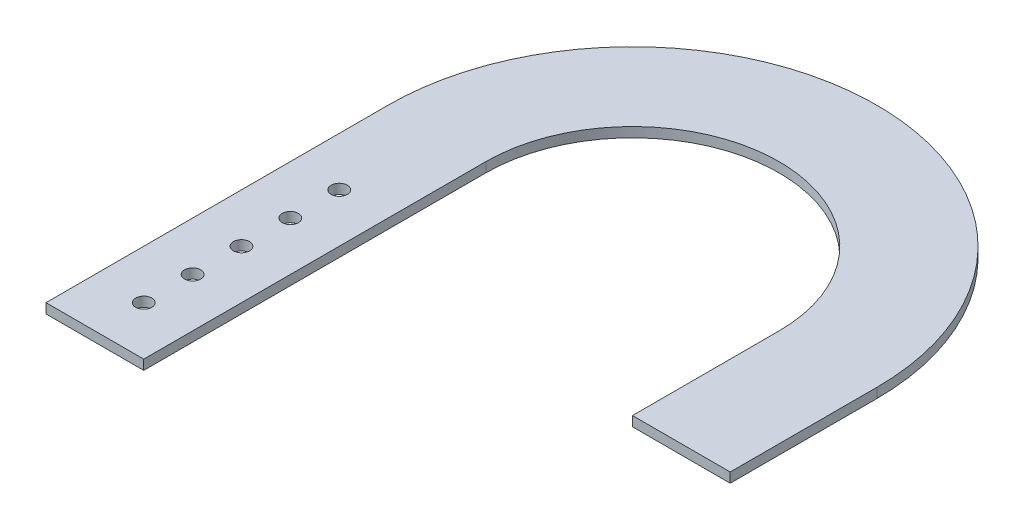
ISO-10303-21;
HEADER;
FILE_DESCRIPTION(('STEP AP214'),'2;1');
FILE_NAME('part.step','',(''),(''),'','','');
FILE_SCHEMA(('AUTOMOTIVE_DESIGN { 1 0 10303 214 1 1 1 1 }'));
ENDSEC;
DATA;
#1=APPLICATION_CONTEXT('core data for automotive mechanical design processes');
#2=APPLICATION_PROTOCOL_DEFINITION('international standard','automotive_design',2000,#1);
#3=PRODUCT_CONTEXT('',#1,'mechanical');
#4=PRODUCT('Part','Part','',(#3));
#5=PRODUCT_RELATED_PRODUCT_CATEGORY('part','',(#4));
#6=PRODUCT_DEFINITION_FORMATION('','',#4);
#7=PRODUCT_DEFINITION_CONTEXT('part definition',#1,'design');
#8=PRODUCT_DEFINITION('design','',#6,#7);
#9=PRODUCT_DEFINITION_SHAPE('','',#8);
#10=(LENGTH_UNIT() NAMED_UNIT(*) SI_UNIT(.MILLI.,.METRE.));
#11=(NAMED_UNIT(*) PLANE_ANGLE_UNIT() SI_UNIT($,.RADIAN.));
#12=(NAMED_UNIT(*) SI_UNIT($,.STERADIAN.) SOLID_ANGLE_UNIT());
#13=UNCERTAINTY_MEASURE_WITH_UNIT(LENGTH_MEASURE(1.E-05),#10,'distance_accuracy_value','');
#14=(GEOMETRIC_REPRESENTATION_CONTEXT(3) GLOBAL_UNCERTAINTY_ASSIGNED_CONTEXT((#13)) GLOBAL_UNIT_ASSIGNED_CONTEXT((#10,
#11,#12)) REPRESENTATION_CONTEXT('',''));
#15=CARTESIAN_POINT('',(0.,0.,0.));
#16=DIRECTION('',(0.,0.,1.));
#17=DIRECTION('',(1.,0.,0.));
#18=AXIS2_PLACEMENT_3D('',#15,#16,#17);
#19=CARTESIAN_POINT('',(0.,2.54,0.));
#20=DIRECTION('',(0.,-1.,0.));
#21=DIRECTION('',(0.,0.,-1.));
#22=AXIS2_PLACEMENT_3D('',#19,#20,#21);
#23=CYLINDRICAL_SURFACE('',#22,38.1);
#24=CARTESIAN_POINT('',(0.,0.,0.));
#25=DIRECTION('',(0.,-1.,0.));
#26=DIRECTION('',(0.,0.,1.));
#27=AXIS2_PLACEMENT_3D('',#24,#25,#26);
#28=CIRCLE('',#27,38.1);
#29=CARTESIAN_POINT('',(-38.1,0.,0.));
#30=VERTEX_POINT('',#29);
#31=CARTESIAN_POINT('',(38.1,0.,0.));
#32=VERTEX_POINT('',#31);
#33=EDGE_CURVE('E172',#30,#32,#28,.T.);
#34=ORIENTED_EDGE('',*,*,#33,.T.);
#35=DIRECTION('',(0.,-1.,0.));
#36=VECTOR('',#35,1.);
#37=CARTESIAN_POINT('',(38.1,2.54,0.));
#38=LINE('',#37,#36);
#39=CARTESIAN_POINT('',(38.1,2.54,0.));
#40=VERTEX_POINT('',#39);
#41=EDGE_CURVE('E13',#40,#32,#38,.T.);
#42=ORIENTED_EDGE('',*,*,#41,.F.);
#43=CARTESIAN_POINT('',(0.,2.54,0.));
#44=DIRECTION('',(0.,-1.,0.));
#45=DIRECTION('',(0.,0.,1.));
#46=AXIS2_PLACEMENT_3D('',#43,#44,#45);
#47=CIRCLE('',#46,38.1);
#48=CARTESIAN_POINT('',(-38.1,2.54,0.));
#49=VERTEX_POINT('',#48);
#50=EDGE_CURVE('E194',#49,#40,#47,.T.);
#51=ORIENTED_EDGE('',*,*,#50,.F.);
#52=DIRECTION('',(0.,-1.,0.));
#53=VECTOR('',#52,1.);
#54=CARTESIAN_POINT('',(-38.1,2.54,0.));
#55=LINE('',#54,#53);
#56=EDGE_CURVE('E168',#49,#30,#55,.T.);
#57=ORIENTED_EDGE('',*,*,#56,.T.);
#58=EDGE_LOOP('',(#34,#42,#51,#57));
#59=FACE_BOUND('',#58,.T.);
#60=ADVANCED_FACE('F53',(#59),#23,.F.);
#61=CARTESIAN_POINT('',(38.1,2.54,0.));
#62=DIRECTION('',(1.,0.,0.));
#63=DIRECTION('',(0.,0.,-1.));
#64=AXIS2_PLACEMENT_3D('',#61,#62,#63);
#65=PLANE('',#64);
#66=DIRECTION('',(0.,0.,1.));
#67=VECTOR('',#66,1.);
#68=CARTESIAN_POINT('',(38.1,0.,0.));
#69=LINE('',#68,#67);
#70=CARTESIAN_POINT('',(38.1,0.,38.1));
#71=VERTEX_POINT('',#70);
#72=EDGE_CURVE('E176',#32,#71,#69,.T.);
#73=ORIENTED_EDGE('',*,*,#72,.T.);
#74=DIRECTION('',(0.,-1.,0.));
#75=VECTOR('',#74,1.);
#76=CARTESIAN_POINT('',(38.1,2.54,38.1));
#77=LINE('',#76,#75);
#78=CARTESIAN_POINT('',(38.1,2.54,38.1));
#79=VERTEX_POINT('',#78);
#80=EDGE_CURVE('E62',#79,#71,#77,.T.);
#81=ORIENTED_EDGE('',*,*,#80,.F.);
#82=DIRECTION('',(0.,0.,1.));
#83=VECTOR('',#82,1.);
#84=CARTESIAN_POINT('',(38.1,2.54,0.));
#85=LINE('',#84,#83);
#86=EDGE_CURVE('E124',#40,#79,#85,.T.);
#87=ORIENTED_EDGE('',*,*,#86,.F.);
#88=ORIENTED_EDGE('',*,*,#41,.T.);
#89=EDGE_LOOP('',(#73,#81,#87,#88));
#90=FACE_BOUND('',#89,.T.);
#91=ADVANCED_FACE('F314',(#90),#65,.F.);
#92=CARTESIAN_POINT('',(38.1,2.54,38.1));
#93=DIRECTION('',(0.,0.,-1.));
#94=DIRECTION('',(-1.,0.,0.));
#95=AXIS2_PLACEMENT_3D('',#92,#93,#94);
#96=PLANE('',#95);
#97=DIRECTION('',(1.,0.,0.));
#98=VECTOR('',#97,1.);
#99=CARTESIAN_POINT('',(38.1,0.,38.1));
#100=LINE('',#99,#98);
#101=CARTESIAN_POINT('',(63.5,0.,38.1));
#102=VERTEX_POINT('',#101);
#103=EDGE_CURVE('E180',#71,#102,#100,.T.);
#104=ORIENTED_EDGE('',*,*,#103,.T.);
#105=DIRECTION('',(0.,-1.,0.));
#106=VECTOR('',#105,1.);
#107=CARTESIAN_POINT('',(63.5,2.54,38.1));
#108=LINE('',#107,#106);
#109=CARTESIAN_POINT('',(63.5,2.54,38.1));
#110=VERTEX_POINT('',#109);
#111=EDGE_CURVE('E204',#110,#102,#108,.T.);
#112=ORIENTED_EDGE('',*,*,#111,.F.);
#113=DIRECTION('',(1.,0.,0.));
#114=VECTOR('',#113,1.);
#115=CARTESIAN_POINT('',(38.1,2.54,38.1));
#116=LINE('',#115,#114);
#117=EDGE_CURVE('E214',#79,#110,#116,.T.);
#118=ORIENTED_EDGE('',*,*,#117,.F.);
#119=ORIENTED_EDGE('',*,*,#80,.T.);
#120=EDGE_LOOP('',(#104,#112,#118,#119));
#121=FACE_BOUND('',#120,.T.);
#122=ADVANCED_FACE('F212',(#121),#96,.F.);
#123=CARTESIAN_POINT('',(63.5,2.54,38.1));
#124=DIRECTION('',(-1.,0.,0.));
#125=DIRECTION('',(0.,0.,1.));
#126=AXIS2_PLACEMENT_3D('',#123,#124,#125);
#127=PLANE('',#126);
#128=DIRECTION('',(0.,0.,-1.));
#129=VECTOR('',#128,1.);
#130=CARTESIAN_POINT('',(63.5,0.,38.1));
#131=LINE('',#130,#129);
#132=CARTESIAN_POINT('',(63.5,0.,0.));
#133=VERTEX_POINT('',#132);
#134=EDGE_CURVE('E183',#102,#133,#131,.T.);
#135=ORIENTED_EDGE('',*,*,#134,.T.);
#136=DIRECTION('',(0.,-1.,0.));
#137=VECTOR('',#136,1.);
#138=CARTESIAN_POINT('',(63.5,2.54,0.));
#139=LINE('',#138,#137);
#140=CARTESIAN_POINT('',(63.5,2.54,0.));
#141=VERTEX_POINT('',#140);
#142=EDGE_CURVE('E200',#141,#133,#139,.T.);
#143=ORIENTED_EDGE('',*,*,#142,.F.);
#144=DIRECTION('',(0.,0.,-1.));
#145=VECTOR('',#144,1.);
#146=CARTESIAN_POINT('',(63.5,2.54,38.1));
#147=LINE('',#146,#145);
#148=EDGE_CURVE('E227',#110,#141,#147,.T.);
#149=ORIENTED_EDGE('',*,*,#148,.F.);
#150=ORIENTED_EDGE('',*,*,#111,.T.);
#151=EDGE_LOOP('',(#135,#143,#149,#150));
#152=FACE_BOUND('',#151,.T.);
#153=ADVANCED_FACE('F222',(#152),#127,.F.);
#154=CARTESIAN_POINT('',(0.,2.54,0.));
#155=DIRECTION('',(0.,-1.,0.));
#156=DIRECTION('',(0.,0.,-1.));
#157=AXIS2_PLACEMENT_3D('',#154,#155,#156);
#158=CYLINDRICAL_SURFACE('',#157,63.5);
#159=CARTESIAN_POINT('',(0.,0.,0.));
#160=DIRECTION('',(0.,1.,0.));
#161=DIRECTION('',(0.,0.,1.));
#162=AXIS2_PLACEMENT_3D('',#159,#160,#161);
#163=CIRCLE('',#162,63.5);
#164=CARTESIAN_POINT('',(-63.5,0.,0.));
#165=VERTEX_POINT('',#164);
#166=EDGE_CURVE('E186',#133,#165,#163,.T.);
#167=ORIENTED_EDGE('',*,*,#166,.T.);
#168=DIRECTION('',(0.,-1.,0.));
#169=VECTOR('',#168,1.);
#170=CARTESIAN_POINT('',(-63.5,2.54,0.));
#171=LINE('',#170,#169);
#172=CARTESIAN_POINT('',(-63.5,2.54,0.));
#173=VERTEX_POINT('',#172);
#174=EDGE_CURVE('E159',#173,#165,#171,.T.);
#175=ORIENTED_EDGE('',*,*,#174,.F.);
#176=CARTESIAN_POINT('',(0.,2.54,0.));
#177=DIRECTION('',(0.,1.,0.));
#178=DIRECTION('',(0.,0.,1.));
#179=AXIS2_PLACEMENT_3D('',#176,#177,#178);
#180=CIRCLE('',#179,63.5);
#181=EDGE_CURVE('E148',#141,#173,#180,.T.);
#182=ORIENTED_EDGE('',*,*,#181,.F.);
#183=ORIENTED_EDGE('',*,*,#142,.T.);
#184=EDGE_LOOP('',(#167,#175,#182,#183));
#185=FACE_BOUND('',#184,.T.);
#186=ADVANCED_FACE('F225',(#185),#158,.T.);
#187=CARTESIAN_POINT('',(-63.5,2.54,0.));
#188=DIRECTION('',(1.,0.,0.));
#189=DIRECTION('',(0.,0.,-1.));
#190=AXIS2_PLACEMENT_3D('',#187,#188,#189);
#191=PLANE('',#190);
#192=DIRECTION('',(0.,0.,1.));
#193=VECTOR('',#192,1.);
#194=CARTESIAN_POINT('',(-63.5,0.,0.));
#195=LINE('',#194,#193);
#196=CARTESIAN_POINT('',(-63.5,0.,88.9));
#197=VERTEX_POINT('',#196);
#198=EDGE_CURVE('E157',#165,#197,#195,.T.);
#199=ORIENTED_EDGE('',*,*,#198,.T.);
#200=DIRECTION('',(0.,-1.,0.));
#201=VECTOR('',#200,1.);
#202=CARTESIAN_POINT('',(-63.5,2.54,88.9));
#203=LINE('',#202,#201);
#204=CARTESIAN_POINT('',(-63.5,2.54,88.9));
#205=VERTEX_POINT('',#204);
#206=EDGE_CURVE('E154',#205,#197,#203,.T.);
#207=ORIENTED_EDGE('',*,*,#206,.F.);
#208=DIRECTION('',(0.,0.,1.));
#209=VECTOR('',#208,1.);
#210=CARTESIAN_POINT('',(-63.5,2.54,0.));
#211=LINE('',#210,#209);
#212=EDGE_CURVE('E142',#173,#205,#211,.T.);
#213=ORIENTED_EDGE('',*,*,#212,.F.);
#214=ORIENTED_EDGE('',*,*,#174,.T.);
#215=EDGE_LOOP('',(#199,#207,#213,#214));
#216=FACE_BOUND('',#215,.T.);
#217=ADVANCED_FACE('F155',(#216),#191,.F.);
#218=CARTESIAN_POINT('',(-63.5,2.54,88.9));
#219=DIRECTION('',(0.,0.,-1.));
#220=DIRECTION('',(-1.,0.,0.));
#221=AXIS2_PLACEMENT_3D('',#218,#219,#220);
#222=PLANE('',#221);
#223=DIRECTION('',(1.,0.,0.));
#224=VECTOR('',#223,1.);
#225=CARTESIAN_POINT('',(-63.5,0.,88.9));
#226=LINE('',#225,#224);
#227=CARTESIAN_POINT('',(-38.1,0.,88.9));
#228=VERTEX_POINT('',#227);
#229=EDGE_CURVE('E109',#197,#228,#226,.T.);
#230=ORIENTED_EDGE('',*,*,#229,.T.);
#231=DIRECTION('',(0.,-1.,0.));
#232=VECTOR('',#231,1.);
#233=CARTESIAN_POINT('',(-38.1,2.54,88.9));
#234=LINE('',#233,#232);
#235=CARTESIAN_POINT('',(-38.1,2.54,88.9));
#236=VERTEX_POINT('',#235);
#237=EDGE_CURVE('E160',#236,#228,#234,.T.);
#238=ORIENTED_EDGE('',*,*,#237,.F.);
#239=DIRECTION('',(1.,0.,0.));
#240=VECTOR('',#239,1.);
#241=CARTESIAN_POINT('',(-63.5,2.54,88.9));
#242=LINE('',#241,#240);
#243=EDGE_CURVE('E146',#205,#236,#242,.T.);
#244=ORIENTED_EDGE('',*,*,#243,.F.);
#245=ORIENTED_EDGE('',*,*,#206,.T.);
#246=EDGE_LOOP('',(#230,#238,#244,#245));
#247=FACE_BOUND('',#246,.T.);
#248=ADVANCED_FACE('F162',(#247),#222,.F.);
#249=CARTESIAN_POINT('',(-38.1,2.54,88.9));
#250=DIRECTION('',(-1.,0.,0.));
#251=DIRECTION('',(0.,0.,1.));
#252=AXIS2_PLACEMENT_3D('',#249,#250,#251);
#253=PLANE('',#252);
#254=DIRECTION('',(0.,0.,-1.));
#255=VECTOR('',#254,1.);
#256=CARTESIAN_POINT('',(-38.1,0.,88.9));
#257=LINE('',#256,#255);
#258=EDGE_CURVE('E116',#228,#30,#257,.T.);
#259=ORIENTED_EDGE('',*,*,#258,.T.);
#260=ORIENTED_EDGE('',*,*,#56,.F.);
#261=DIRECTION('',(0.,0.,-1.));
#262=VECTOR('',#261,1.);
#263=CARTESIAN_POINT('',(-38.1,2.54,88.9));
#264=LINE('',#263,#262);
#265=EDGE_CURVE('E73',#236,#49,#264,.T.);
#266=ORIENTED_EDGE('',*,*,#265,.F.);
#267=ORIENTED_EDGE('',*,*,#237,.T.);
#268=EDGE_LOOP('',(#259,#260,#266,#267));
#269=FACE_BOUND('',#268,.T.);
#270=ADVANCED_FACE('F289',(#269),#253,.F.);
#271=CARTESIAN_POINT('',(0.,2.54,0.));
#272=DIRECTION('',(0.,1.,0.));
#273=DIRECTION('',(0.,0.,1.));
#274=AXIS2_PLACEMENT_3D('',#271,#272,#273);
#275=PLANE('',#274);
#276=CARTESIAN_POINT('',(-50.8,2.54,76.2));
#277=DIRECTION('',(0.,1.,0.));
#278=DIRECTION('',(0.,0.,1.));
#279=AXIS2_PLACEMENT_3D('',#276,#277,#278);
#280=CIRCLE('',#279,2.0955);
#281=CARTESIAN_POINT('',(-50.8,2.54,78.2955));
#282=VERTEX_POINT('',#281);
#283=EDGE_CURVE('E270',#282,#282,#280,.T.);
#284=ORIENTED_EDGE('',*,*,#283,.F.);
#285=EDGE_LOOP('',(#284));
#286=FACE_BOUND('',#285,.T.);
#287=CARTESIAN_POINT('',(-50.8,2.54,63.5));
#288=DIRECTION('',(0.,1.,0.));
#289=DIRECTION('',(0.,0.,1.));
#290=AXIS2_PLACEMENT_3D('',#287,#288,#289);
#291=CIRCLE('',#290,2.0955);
#292=CARTESIAN_POINT('',(-50.8,2.54,65.5955));
#293=VERTEX_POINT('',#292);
#294=EDGE_CURVE('E262',#293,#293,#291,.T.);
#295=ORIENTED_EDGE('',*,*,#294,.F.);
#296=EDGE_LOOP('',(#295));
#297=FACE_BOUND('',#296,.T.);
#298=CARTESIAN_POINT('',(-50.8000000000001,2.54,50.8));
#299=DIRECTION('',(0.,1.,0.));
#300=DIRECTION('',(0.,0.,1.));
#301=AXIS2_PLACEMENT_3D('',#298,#299,#300);
#302=CIRCLE('',#301,2.0955);
#303=CARTESIAN_POINT('',(-50.8000000000001,2.54,52.8955));
#304=VERTEX_POINT('',#303);
#305=EDGE_CURVE('E254',#304,#304,#302,.T.);
#306=ORIENTED_EDGE('',*,*,#305,.F.);
#307=EDGE_LOOP('',(#306));
#308=FACE_BOUND('',#307,.T.);
#309=CARTESIAN_POINT('',(-50.8000000000001,2.54,38.1));
#310=DIRECTION('',(0.,1.,0.));
#311=DIRECTION('',(0.,0.,1.));
#312=AXIS2_PLACEMENT_3D('',#309,#310,#311);
#313=CIRCLE('',#312,2.0955);
#314=CARTESIAN_POINT('',(-50.8000000000001,2.54,40.1955));
#315=VERTEX_POINT('',#314);
#316=EDGE_CURVE('E246',#315,#315,#313,.T.);
#317=ORIENTED_EDGE('',*,*,#316,.F.);
#318=EDGE_LOOP('',(#317));
#319=FACE_BOUND('',#318,.T.);
#320=CARTESIAN_POINT('',(-50.8000000000002,2.54,25.4));
#321=DIRECTION('',(0.,1.,0.));
#322=DIRECTION('',(0.,0.,1.));
#323=AXIS2_PLACEMENT_3D('',#320,#321,#322);
#324=CIRCLE('',#323,2.0955);
#325=CARTESIAN_POINT('',(-50.8000000000002,2.54,27.4955));
#326=VERTEX_POINT('',#325);
#327=EDGE_CURVE('E238',#326,#326,#324,.T.);
#328=ORIENTED_EDGE('',*,*,#327,.F.);
#329=EDGE_LOOP('',(#328));
#330=FACE_BOUND('',#329,.T.);
#331=ORIENTED_EDGE('',*,*,#50,.T.);
#332=ORIENTED_EDGE('',*,*,#86,.T.);
#333=ORIENTED_EDGE('',*,*,#117,.T.);
#334=ORIENTED_EDGE('',*,*,#148,.T.);
#335=ORIENTED_EDGE('',*,*,#181,.T.);
#336=ORIENTED_EDGE('',*,*,#212,.T.);
#337=ORIENTED_EDGE('',*,*,#243,.T.);
#338=ORIENTED_EDGE('',*,*,#265,.T.);
#339=EDGE_LOOP('',(#331,#332,#333,#334,#335,#336,#337,#338));
#340=FACE_BOUND('',#339,.T.);
#341=ADVANCED_FACE('F144',(#286,#297,#308,#319,#330,#340),#275,.T.);
#342=CARTESIAN_POINT('',(0.,0.,0.));
#343=DIRECTION('',(0.,1.,0.));
#344=DIRECTION('',(0.,0.,1.));
#345=AXIS2_PLACEMENT_3D('',#342,#343,#344);
#346=PLANE('',#345);
#347=CARTESIAN_POINT('',(-50.8,0.,76.2));
#348=DIRECTION('',(0.,1.,0.));
#349=DIRECTION('',(0.,0.,1.));
#350=AXIS2_PLACEMENT_3D('',#347,#348,#349);
#351=CIRCLE('',#350,2.0955);
#352=CARTESIAN_POINT('',(-50.8,0.,78.2955));
#353=VERTEX_POINT('',#352);
#354=EDGE_CURVE('E177',#353,#353,#351,.T.);
#355=ORIENTED_EDGE('',*,*,#354,.T.);
#356=EDGE_LOOP('',(#355));
#357=FACE_BOUND('',#356,.T.);
#358=CARTESIAN_POINT('',(-50.8,0.,63.5));
#359=DIRECTION('',(0.,1.,0.));
#360=DIRECTION('',(0.,0.,1.));
#361=AXIS2_PLACEMENT_3D('',#358,#359,#360);
#362=CIRCLE('',#361,2.0955);
#363=CARTESIAN_POINT('',(-50.8,0.,65.5955));
#364=VERTEX_POINT('',#363);
#365=EDGE_CURVE('E266',#364,#364,#362,.T.);
#366=ORIENTED_EDGE('',*,*,#365,.T.);
#367=EDGE_LOOP('',(#366));
#368=FACE_BOUND('',#367,.T.);
#369=CARTESIAN_POINT('',(-50.8000000000001,0.,50.8));
#370=DIRECTION('',(0.,1.,0.));
#371=DIRECTION('',(0.,0.,1.));
#372=AXIS2_PLACEMENT_3D('',#369,#370,#371);
#373=CIRCLE('',#372,2.0955);
#374=CARTESIAN_POINT('',(-50.8000000000001,0.,52.8955));
#375=VERTEX_POINT('',#374);
#376=EDGE_CURVE('E258',#375,#375,#373,.T.);
#377=ORIENTED_EDGE('',*,*,#376,.T.);
#378=EDGE_LOOP('',(#377));
#379=FACE_BOUND('',#378,.T.);
#380=CARTESIAN_POINT('',(-50.8000000000001,0.,38.1));
#381=DIRECTION('',(0.,1.,0.));
#382=DIRECTION('',(0.,0.,1.));
#383=AXIS2_PLACEMENT_3D('',#380,#381,#382);
#384=CIRCLE('',#383,2.0955);
#385=CARTESIAN_POINT('',(-50.8000000000001,0.,40.1955));
#386=VERTEX_POINT('',#385);
#387=EDGE_CURVE('E250',#386,#386,#384,.T.);
#388=ORIENTED_EDGE('',*,*,#387,.T.);
#389=EDGE_LOOP('',(#388));
#390=FACE_BOUND('',#389,.T.);
#391=CARTESIAN_POINT('',(-50.8000000000002,0.,25.4));
#392=DIRECTION('',(0.,1.,0.));
#393=DIRECTION('',(0.,0.,1.));
#394=AXIS2_PLACEMENT_3D('',#391,#392,#393);
#395=CIRCLE('',#394,2.0955);
#396=CARTESIAN_POINT('',(-50.8000000000002,0.,27.4955));
#397=VERTEX_POINT('',#396);
#398=EDGE_CURVE('E242',#397,#397,#395,.T.);
#399=ORIENTED_EDGE('',*,*,#398,.T.);
#400=EDGE_LOOP('',(#399));
#401=FACE_BOUND('',#400,.T.);
#402=ORIENTED_EDGE('',*,*,#33,.F.);
#403=ORIENTED_EDGE('',*,*,#258,.F.);
#404=ORIENTED_EDGE('',*,*,#229,.F.);
#405=ORIENTED_EDGE('',*,*,#198,.F.);
#406=ORIENTED_EDGE('',*,*,#166,.F.);
#407=ORIENTED_EDGE('',*,*,#134,.F.);
#408=ORIENTED_EDGE('',*,*,#103,.F.);
#409=ORIENTED_EDGE('',*,*,#72,.F.);
#410=EDGE_LOOP('',(#402,#403,#404,#405,#406,#407,#408,#409));
#411=FACE_BOUND('',#410,.T.);
#412=ADVANCED_FACE('F218',(#357,#368,#379,#390,#401,#411),#346,.F.);
#413=CARTESIAN_POINT('',(-50.8000000000002,0.,25.4));
#414=DIRECTION('',(0.,1.,0.));
#415=DIRECTION('',(0.,0.,1.));
#416=AXIS2_PLACEMENT_3D('',#413,#414,#415);
#417=CYLINDRICAL_SURFACE('',#416,2.0955);
#418=ORIENTED_EDGE('',*,*,#398,.F.);
#419=EDGE_LOOP('',(#418));
#420=FACE_BOUND('',#419,.T.);
#421=ORIENTED_EDGE('',*,*,#327,.T.);
#422=EDGE_LOOP('',(#421));
#423=FACE_BOUND('',#422,.T.);
#424=ADVANCED_FACE('F299',(#420,#423),#417,.F.);
#425=CARTESIAN_POINT('',(-50.8000000000001,0.,38.1));
#426=DIRECTION('',(0.,1.,0.));
#427=DIRECTION('',(0.,0.,1.));
#428=AXIS2_PLACEMENT_3D('',#425,#426,#427);
#429=CYLINDRICAL_SURFACE('',#428,2.0955);
#430=ORIENTED_EDGE('',*,*,#387,.F.);
#431=EDGE_LOOP('',(#430));
#432=FACE_BOUND('',#431,.T.);
#433=ORIENTED_EDGE('',*,*,#316,.T.);
#434=EDGE_LOOP('',(#433));
#435=FACE_BOUND('',#434,.T.);
#436=ADVANCED_FACE('F301',(#432,#435),#429,.F.);
#437=CARTESIAN_POINT('',(-50.8000000000001,0.,50.8));
#438=DIRECTION('',(0.,1.,0.));
#439=DIRECTION('',(0.,0.,1.));
#440=AXIS2_PLACEMENT_3D('',#437,#438,#439);
#441=CYLINDRICAL_SURFACE('',#440,2.0955);
#442=ORIENTED_EDGE('',*,*,#376,.F.);
#443=EDGE_LOOP('',(#442));
#444=FACE_BOUND('',#443,.T.);
#445=ORIENTED_EDGE('',*,*,#305,.T.);
#446=EDGE_LOOP('',(#445));
#447=FACE_BOUND('',#446,.T.);
#448=ADVANCED_FACE('F308',(#444,#447),#441,.F.);
#449=CARTESIAN_POINT('',(-50.8,0.,63.5));
#450=DIRECTION('',(0.,1.,0.));
#451=DIRECTION('',(0.,0.,1.));
#452=AXIS2_PLACEMENT_3D('',#449,#450,#451);
#453=CYLINDRICAL_SURFACE('',#452,2.0955);
#454=ORIENTED_EDGE('',*,*,#365,.F.);
#455=EDGE_LOOP('',(#454));
#456=FACE_BOUND('',#455,.T.);
#457=ORIENTED_EDGE('',*,*,#294,.T.);
#458=EDGE_LOOP('',(#457));
#459=FACE_BOUND('',#458,.T.);
#460=ADVANCED_FACE('F283',(#456,#459),#453,.F.);
#461=CARTESIAN_POINT('',(-50.8,0.,76.2));
#462=DIRECTION('',(0.,1.,0.));
#463=DIRECTION('',(0.,0.,1.));
#464=AXIS2_PLACEMENT_3D('',#461,#462,#463);
#465=CYLINDRICAL_SURFACE('',#464,2.0955);
#466=ORIENTED_EDGE('',*,*,#354,.F.);
#467=EDGE_LOOP('',(#466));
#468=FACE_BOUND('',#467,.T.);
#469=ORIENTED_EDGE('',*,*,#283,.T.);
#470=EDGE_LOOP('',(#469));
#471=FACE_BOUND('',#470,.T.);
#472=ADVANCED_FACE('F280',(#468,#471),#465,.F.);
#473=CLOSED_SHELL('',(#60,#91,#122,#153,#186,#217,#248,#270,#341,#412,#424,#436,#448,#460,#472));
#474=MANIFOLD_SOLID_BREP('B2',#473);
#475=ADVANCED_BREP_SHAPE_REPRESENTATION('',(#18,#474),#14);
#476=SHAPE_DEFINITION_REPRESENTATION(#9,#475);
ENDSEC;
END-ISO-10303-21;
